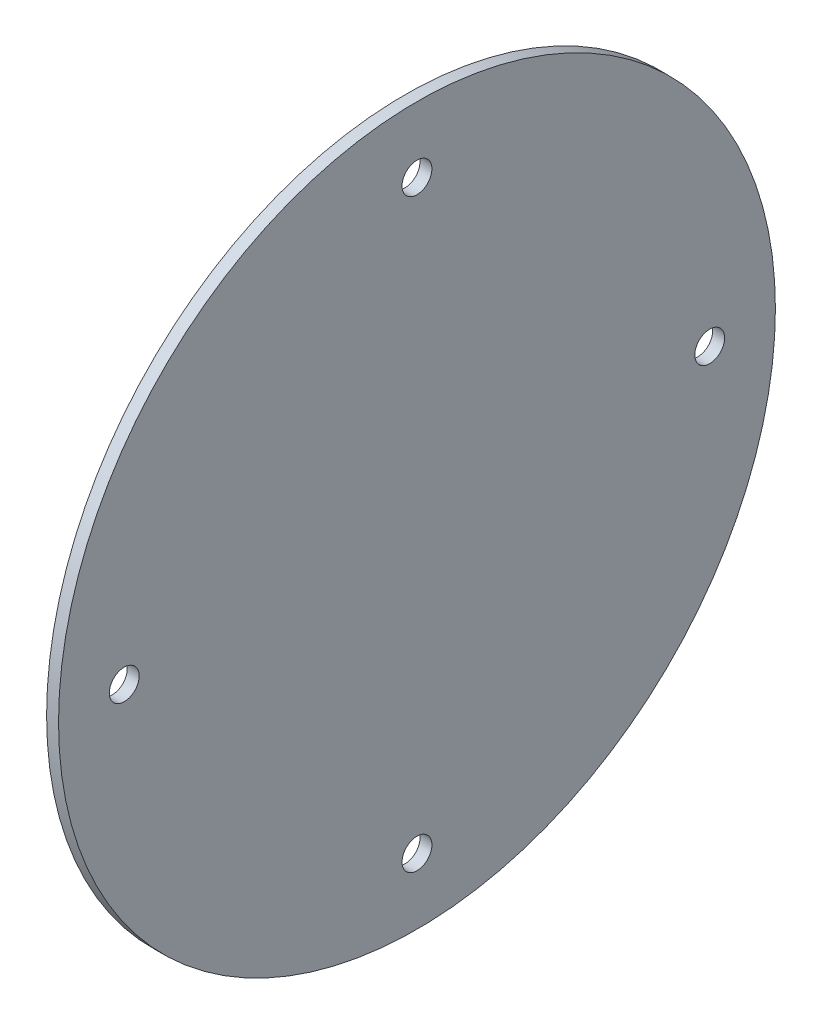
ISO-10303-21;
HEADER;
FILE_DESCRIPTION(('STEP AP214'),'2;1');
FILE_NAME('part.step','',(''),(''),'','','');
FILE_SCHEMA(('AUTOMOTIVE_DESIGN { 1 0 10303 214 1 1 1 1 }'));
ENDSEC;
DATA;
#1=APPLICATION_CONTEXT('core data for automotive mechanical design processes');
#2=APPLICATION_PROTOCOL_DEFINITION('international standard','automotive_design',2000,#1);
#3=PRODUCT_CONTEXT('',#1,'mechanical');
#4=PRODUCT('Part','Part','',(#3));
#5=PRODUCT_RELATED_PRODUCT_CATEGORY('part','',(#4));
#6=PRODUCT_DEFINITION_FORMATION('','',#4);
#7=PRODUCT_DEFINITION_CONTEXT('part definition',#1,'design');
#8=PRODUCT_DEFINITION('design','',#6,#7);
#9=PRODUCT_DEFINITION_SHAPE('','',#8);
#10=(LENGTH_UNIT() NAMED_UNIT(*) SI_UNIT(.MILLI.,.METRE.));
#11=(NAMED_UNIT(*) PLANE_ANGLE_UNIT() SI_UNIT($,.RADIAN.));
#12=(NAMED_UNIT(*) SI_UNIT($,.STERADIAN.) SOLID_ANGLE_UNIT());
#13=UNCERTAINTY_MEASURE_WITH_UNIT(LENGTH_MEASURE(1.E-05),#10,'distance_accuracy_value','');
#14=(GEOMETRIC_REPRESENTATION_CONTEXT(3) GLOBAL_UNCERTAINTY_ASSIGNED_CONTEXT((#13)) GLOBAL_UNIT_ASSIGNED_CONTEXT((#10,
#11,#12)) REPRESENTATION_CONTEXT('',''));
#15=CARTESIAN_POINT('',(0.,0.,0.));
#16=DIRECTION('',(0.,0.,1.));
#17=DIRECTION('',(1.,0.,0.));
#18=AXIS2_PLACEMENT_3D('',#15,#16,#17);
#19=CARTESIAN_POINT('',(2.54,0.,0.));
#20=DIRECTION('',(-1.,0.,0.));
#21=DIRECTION('',(0.,0.,1.));
#22=AXIS2_PLACEMENT_3D('',#19,#20,#21);
#23=CYLINDRICAL_SURFACE('',#22,76.2);
#24=CARTESIAN_POINT('',(2.54,0.,0.));
#25=DIRECTION('',(1.,0.,0.));
#26=DIRECTION('',(0.,0.,-1.));
#27=AXIS2_PLACEMENT_3D('',#24,#25,#26);
#28=CIRCLE('',#27,76.2);
#29=CARTESIAN_POINT('',(2.54,0.,-76.2));
#30=VERTEX_POINT('',#29);
#31=EDGE_CURVE('E10',#30,#30,#28,.T.);
#32=ORIENTED_EDGE('',*,*,#31,.F.);
#33=EDGE_LOOP('',(#32));
#34=FACE_BOUND('',#33,.T.);
#35=CARTESIAN_POINT('',(0.,0.,0.));
#36=DIRECTION('',(1.,0.,0.));
#37=DIRECTION('',(0.,0.,-1.));
#38=AXIS2_PLACEMENT_3D('',#35,#36,#37);
#39=CIRCLE('',#38,76.2);
#40=CARTESIAN_POINT('',(0.,0.,-76.2));
#41=VERTEX_POINT('',#40);
#42=EDGE_CURVE('E46',#41,#41,#39,.T.);
#43=ORIENTED_EDGE('',*,*,#42,.T.);
#44=EDGE_LOOP('',(#43));
#45=FACE_BOUND('',#44,.T.);
#46=ADVANCED_FACE('F43',(#34,#45),#23,.T.);
#47=CARTESIAN_POINT('',(2.54,0.,0.));
#48=DIRECTION('',(1.,0.,0.));
#49=DIRECTION('',(0.,0.,-1.));
#50=AXIS2_PLACEMENT_3D('',#47,#48,#49);
#51=PLANE('',#50);
#52=CARTESIAN_POINT('',(2.54,-62.23,-2.24895860747302E-13));
#53=DIRECTION('',(1.,0.,0.));
#54=DIRECTION('',(0.,1.,0.));
#55=AXIS2_PLACEMENT_3D('',#52,#53,#54);
#56=CIRCLE('',#55,3.175);
#57=CARTESIAN_POINT('',(2.54,-59.055,-2.13810407496475E-13));
#58=VERTEX_POINT('',#57);
#59=EDGE_CURVE('E81',#58,#58,#56,.T.);
#60=ORIENTED_EDGE('',*,*,#59,.F.);
#61=EDGE_LOOP('',(#60));
#62=FACE_BOUND('',#61,.T.);
#63=CARTESIAN_POINT('',(2.54,0.,-62.23));
#64=DIRECTION('',(1.,0.,0.));
#65=DIRECTION('',(0.,0.,1.));
#66=AXIS2_PLACEMENT_3D('',#63,#64,#65);
#67=CIRCLE('',#66,3.175);
#68=CARTESIAN_POINT('',(2.54,0.,-59.055));
#69=VERTEX_POINT('',#68);
#70=EDGE_CURVE('E73',#69,#69,#67,.T.);
#71=ORIENTED_EDGE('',*,*,#70,.F.);
#72=EDGE_LOOP('',(#71));
#73=FACE_BOUND('',#72,.T.);
#74=CARTESIAN_POINT('',(2.54,62.23,6.59445628179719E-13));
#75=DIRECTION('',(1.,0.,0.));
#76=DIRECTION('',(0.,-1.,0.));
#77=AXIS2_PLACEMENT_3D('',#74,#75,#76);
#78=CIRCLE('',#77,3.175);
#79=CARTESIAN_POINT('',(2.54,59.055,6.26189268427238E-13));
#80=VERTEX_POINT('',#79);
#81=EDGE_CURVE('E65',#80,#80,#78,.T.);
#82=ORIENTED_EDGE('',*,*,#81,.F.);
#83=EDGE_LOOP('',(#82));
#84=FACE_BOUND('',#83,.T.);
#85=CARTESIAN_POINT('',(2.54,0.,62.23));
#86=DIRECTION('',(1.,0.,0.));
#87=DIRECTION('',(0.,0.,-1.));
#88=AXIS2_PLACEMENT_3D('',#85,#86,#87);
#89=CIRCLE('',#88,3.175);
#90=CARTESIAN_POINT('',(2.54,0.,59.055));
#91=VERTEX_POINT('',#90);
#92=EDGE_CURVE('E57',#91,#91,#89,.T.);
#93=ORIENTED_EDGE('',*,*,#92,.F.);
#94=EDGE_LOOP('',(#93));
#95=FACE_BOUND('',#94,.T.);
#96=ORIENTED_EDGE('',*,*,#31,.T.);
#97=EDGE_LOOP('',(#96));
#98=FACE_BOUND('',#97,.T.);
#99=ADVANCED_FACE('F99',(#62,#73,#84,#95,#98),#51,.T.);
#100=CARTESIAN_POINT('',(0.,0.,0.));
#101=DIRECTION('',(1.,0.,0.));
#102=DIRECTION('',(0.,0.,-1.));
#103=AXIS2_PLACEMENT_3D('',#100,#101,#102);
#104=PLANE('',#103);
#105=CARTESIAN_POINT('',(0.,-62.23,-2.24895860747302E-13));
#106=DIRECTION('',(1.,0.,0.));
#107=DIRECTION('',(0.,1.,0.));
#108=AXIS2_PLACEMENT_3D('',#105,#106,#107);
#109=CIRCLE('',#108,3.175);
#110=CARTESIAN_POINT('',(0.,-59.055,-2.13810407496475E-13));
#111=VERTEX_POINT('',#110);
#112=EDGE_CURVE('E61',#111,#111,#109,.T.);
#113=ORIENTED_EDGE('',*,*,#112,.T.);
#114=EDGE_LOOP('',(#113));
#115=FACE_BOUND('',#114,.T.);
#116=CARTESIAN_POINT('',(0.,0.,-62.23));
#117=DIRECTION('',(1.,0.,0.));
#118=DIRECTION('',(0.,0.,1.));
#119=AXIS2_PLACEMENT_3D('',#116,#117,#118);
#120=CIRCLE('',#119,3.175);
#121=CARTESIAN_POINT('',(0.,0.,-59.055));
#122=VERTEX_POINT('',#121);
#123=EDGE_CURVE('E77',#122,#122,#120,.T.);
#124=ORIENTED_EDGE('',*,*,#123,.T.);
#125=EDGE_LOOP('',(#124));
#126=FACE_BOUND('',#125,.T.);
#127=CARTESIAN_POINT('',(0.,62.23,6.59445628179719E-13));
#128=DIRECTION('',(1.,0.,0.));
#129=DIRECTION('',(0.,-1.,0.));
#130=AXIS2_PLACEMENT_3D('',#127,#128,#129);
#131=CIRCLE('',#130,3.175);
#132=CARTESIAN_POINT('',(0.,59.055,6.26189268427238E-13));
#133=VERTEX_POINT('',#132);
#134=EDGE_CURVE('E69',#133,#133,#131,.T.);
#135=ORIENTED_EDGE('',*,*,#134,.T.);
#136=EDGE_LOOP('',(#135));
#137=FACE_BOUND('',#136,.T.);
#138=CARTESIAN_POINT('',(0.,0.,62.23));
#139=DIRECTION('',(1.,0.,0.));
#140=DIRECTION('',(0.,0.,-1.));
#141=AXIS2_PLACEMENT_3D('',#138,#139,#140);
#142=CIRCLE('',#141,3.175);
#143=CARTESIAN_POINT('',(0.,0.,59.055));
#144=VERTEX_POINT('',#143);
#145=EDGE_CURVE('E55',#144,#144,#142,.T.);
#146=ORIENTED_EDGE('',*,*,#145,.T.);
#147=EDGE_LOOP('',(#146));
#148=FACE_BOUND('',#147,.T.);
#149=ORIENTED_EDGE('',*,*,#42,.F.);
#150=EDGE_LOOP('',(#149));
#151=FACE_BOUND('',#150,.T.);
#152=ADVANCED_FACE('F89',(#115,#126,#137,#148,#151),#104,.F.);
#153=CARTESIAN_POINT('',(0.,0.,62.23));
#154=DIRECTION('',(1.,0.,0.));
#155=DIRECTION('',(0.,0.,-1.));
#156=AXIS2_PLACEMENT_3D('',#153,#154,#155);
#157=CYLINDRICAL_SURFACE('',#156,3.175);
#158=ORIENTED_EDGE('',*,*,#145,.F.);
#159=EDGE_LOOP('',(#158));
#160=FACE_BOUND('',#159,.T.);
#161=ORIENTED_EDGE('',*,*,#92,.T.);
#162=EDGE_LOOP('',(#161));
#163=FACE_BOUND('',#162,.T.);
#164=ADVANCED_FACE('F109',(#160,#163),#157,.F.);
#165=CARTESIAN_POINT('',(0.,62.23,6.59445628179719E-13));
#166=DIRECTION('',(1.,0.,0.));
#167=DIRECTION('',(0.,0.,-1.));
#168=AXIS2_PLACEMENT_3D('',#165,#166,#167);
#169=CYLINDRICAL_SURFACE('',#168,3.175);
#170=ORIENTED_EDGE('',*,*,#134,.F.);
#171=EDGE_LOOP('',(#170));
#172=FACE_BOUND('',#171,.T.);
#173=ORIENTED_EDGE('',*,*,#81,.T.);
#174=EDGE_LOOP('',(#173));
#175=FACE_BOUND('',#174,.T.);
#176=ADVANCED_FACE('F111',(#172,#175),#169,.F.);
#177=CARTESIAN_POINT('',(0.,0.,-62.23));
#178=DIRECTION('',(1.,0.,0.));
#179=DIRECTION('',(0.,0.,-1.));
#180=AXIS2_PLACEMENT_3D('',#177,#178,#179);
#181=CYLINDRICAL_SURFACE('',#180,3.175);
#182=ORIENTED_EDGE('',*,*,#123,.F.);
#183=EDGE_LOOP('',(#182));
#184=FACE_BOUND('',#183,.T.);
#185=ORIENTED_EDGE('',*,*,#70,.T.);
#186=EDGE_LOOP('',(#185));
#187=FACE_BOUND('',#186,.T.);
#188=ADVANCED_FACE('F95',(#184,#187),#181,.F.);
#189=CARTESIAN_POINT('',(0.,-62.23,-2.24895860747302E-13));
#190=DIRECTION('',(1.,0.,0.));
#191=DIRECTION('',(0.,0.,-1.));
#192=AXIS2_PLACEMENT_3D('',#189,#190,#191);
#193=CYLINDRICAL_SURFACE('',#192,3.175);
#194=ORIENTED_EDGE('',*,*,#112,.F.);
#195=EDGE_LOOP('',(#194));
#196=FACE_BOUND('',#195,.T.);
#197=ORIENTED_EDGE('',*,*,#59,.T.);
#198=EDGE_LOOP('',(#197));
#199=FACE_BOUND('',#198,.T.);
#200=ADVANCED_FACE('F92',(#196,#199),#193,.F.);
#201=CLOSED_SHELL('',(#46,#99,#152,#164,#176,#188,#200));
#202=MANIFOLD_SOLID_BREP('B2',#201);
#203=ADVANCED_BREP_SHAPE_REPRESENTATION('',(#18,#202),#14);
#204=SHAPE_DEFINITION_REPRESENTATION(#9,#203);
ENDSEC;
END-ISO-10303-21;
